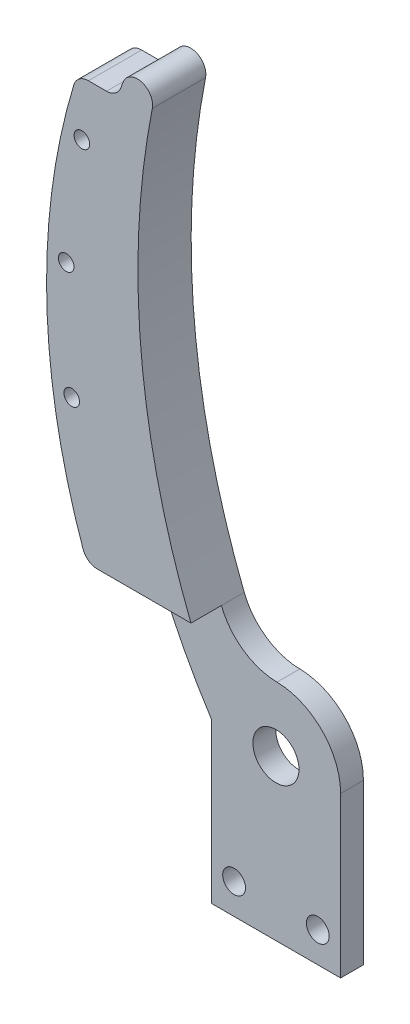
ISO-10303-21;
HEADER;
FILE_DESCRIPTION(('STEP AP214'),'2;1');
FILE_NAME('part.step','',(''),(''),'','','');
FILE_SCHEMA(('AUTOMOTIVE_DESIGN { 1 0 10303 214 1 1 1 1 }'));
ENDSEC;
DATA;
#1=APPLICATION_CONTEXT('core data for automotive mechanical design processes');
#2=APPLICATION_PROTOCOL_DEFINITION('international standard','automotive_design',2000,#1);
#3=PRODUCT_CONTEXT('',#1,'mechanical');
#4=PRODUCT('Part','Part','',(#3));
#5=PRODUCT_RELATED_PRODUCT_CATEGORY('part','',(#4));
#6=PRODUCT_DEFINITION_FORMATION('','',#4);
#7=PRODUCT_DEFINITION_CONTEXT('part definition',#1,'design');
#8=PRODUCT_DEFINITION('design','',#6,#7);
#9=PRODUCT_DEFINITION_SHAPE('','',#8);
#10=(LENGTH_UNIT() NAMED_UNIT(*) SI_UNIT(.MILLI.,.METRE.));
#11=(NAMED_UNIT(*) PLANE_ANGLE_UNIT() SI_UNIT($,.RADIAN.));
#12=(NAMED_UNIT(*) SI_UNIT($,.STERADIAN.) SOLID_ANGLE_UNIT());
#13=UNCERTAINTY_MEASURE_WITH_UNIT(LENGTH_MEASURE(1.E-05),#10,'distance_accuracy_value','');
#14=(GEOMETRIC_REPRESENTATION_CONTEXT(3) GLOBAL_UNCERTAINTY_ASSIGNED_CONTEXT((#13)) GLOBAL_UNIT_ASSIGNED_CONTEXT((#10,
#11,#12)) REPRESENTATION_CONTEXT('',''));
#15=CARTESIAN_POINT('',(0.,0.,0.));
#16=DIRECTION('',(0.,0.,1.));
#17=DIRECTION('',(1.,0.,0.));
#18=AXIS2_PLACEMENT_3D('',#15,#16,#17);
#19=CARTESIAN_POINT('',(0.,0.,7.));
#20=DIRECTION('',(0.,0.,1.));
#21=DIRECTION('',(1.,0.,0.));
#22=AXIS2_PLACEMENT_3D('',#19,#20,#21);
#23=PLANE('',#22);
#24=CARTESIAN_POINT('',(-13.0088572652672,82.4189639360738,7.));
#25=DIRECTION('',(0.,0.,-1.));
#26=DIRECTION('',(-1.,0.,0.));
#27=AXIS2_PLACEMENT_3D('',#24,#25,#26);
#28=CIRCLE('',#27,1.025);
#29=CARTESIAN_POINT('',(-14.0338572652672,82.4189639360738,7.));
#30=VERTEX_POINT('',#29);
#31=EDGE_CURVE('E365',#30,#30,#28,.T.);
#32=ORIENTED_EDGE('',*,*,#31,.T.);
#33=EDGE_LOOP('',(#32));
#34=FACE_BOUND('',#33,.T.);
#35=CARTESIAN_POINT('',(-15.0695569121837,67.4189639360738,7.));
#36=DIRECTION('',(0.,0.,-1.));
#37=DIRECTION('',(-1.,0.,0.));
#38=AXIS2_PLACEMENT_3D('',#35,#36,#37);
#39=CIRCLE('',#38,1.025);
#40=CARTESIAN_POINT('',(-16.0945569121837,67.4189639360738,7.));
#41=VERTEX_POINT('',#40);
#42=EDGE_CURVE('E356',#41,#41,#39,.T.);
#43=ORIENTED_EDGE('',*,*,#42,.T.);
#44=EDGE_LOOP('',(#43));
#45=FACE_BOUND('',#44,.T.);
#46=CARTESIAN_POINT('',(66.3533376194957,63.8746380364105,7.));
#47=DIRECTION('',(0.,0.,1.));
#48=DIRECTION('',(1.,0.,0.));
#49=AXIS2_PLACEMENT_3D('',#46,#47,#48);
#50=CIRCLE('',#49,84.);
#51=CARTESIAN_POINT('',(-12.850623404829,35.8972800829287,7.));
#52=VERTEX_POINT('',#51);
#53=CARTESIAN_POINT('',(-14.0651603690342,88.1411825219531,7.));
#54=VERTEX_POINT('',#53);
#55=EDGE_CURVE('E303',#52,#54,#50,.F.);
#56=ORIENTED_EDGE('',*,*,#55,.F.);
#57=CARTESIAN_POINT('',(-10.9648148090118,36.5634076532497,7.));
#58=DIRECTION('',(0.,0.,1.));
#59=DIRECTION('',(1.,0.,0.));
#60=AXIS2_PLACEMENT_3D('',#57,#58,#59);
#61=CIRCLE('',#60,2.);
#62=CARTESIAN_POINT('',(-10.9648148090118,34.5634076532497,7.));
#63=VERTEX_POINT('',#62);
#64=EDGE_CURVE('E167',#52,#63,#61,.T.);
#65=ORIENTED_EDGE('',*,*,#64,.T.);
#66=DIRECTION('',(1.,0.,0.));
#67=VECTOR('',#66,1.);
#68=CARTESIAN_POINT('',(0.,34.5634076532497,7.));
#69=LINE('',#68,#67);
#70=CARTESIAN_POINT('',(1.32762574070365,34.5634076532497,7.));
#71=VERTEX_POINT('',#70);
#72=EDGE_CURVE('E158',#63,#71,#69,.T.);
#73=ORIENTED_EDGE('',*,*,#72,.T.);
#74=CARTESIAN_POINT('',(94.3576937723887,71.243190122889,7.));
#75=DIRECTION('',(0.,0.,1.));
#76=DIRECTION('',(1.,0.,0.));
#77=AXIS2_PLACEMENT_3D('',#74,#75,#76);
#78=CIRCLE('',#77,100.);
#79=CARTESIAN_POINT('',(-3.74850130602634,90.6126115710371,7.));
#80=VERTEX_POINT('',#79);
#81=EDGE_CURVE('E164',#71,#80,#78,.F.);
#82=ORIENTED_EDGE('',*,*,#81,.T.);
#83=CARTESIAN_POINT('',(-5.71062520759463,91.,7.));
#84=DIRECTION('',(0.,0.,1.));
#85=DIRECTION('',(1.,0.,0.));
#86=AXIS2_PLACEMENT_3D('',#83,#84,#85);
#87=CIRCLE('',#86,1.99999999999999);
#88=CARTESIAN_POINT('',(-7.5824164498567,91.7045548561972,7.));
#89=VERTEX_POINT('',#88);
#90=EDGE_CURVE('E183',#80,#89,#87,.T.);
#91=ORIENTED_EDGE('',*,*,#90,.T.);
#92=CARTESIAN_POINT('',(66.3533376194957,63.8746380364105,7.));
#93=DIRECTION('',(0.,0.,1.));
#94=DIRECTION('',(1.,0.,0.));
#95=AXIS2_PLACEMENT_3D('',#92,#93,#94);
#96=CIRCLE('',#95,79.);
#97=CARTESIAN_POINT('',(-7.8876535794882,90.8797343293771,7.));
#98=VERTEX_POINT('',#97);
#99=EDGE_CURVE('E171',#89,#98,#96,.T.);
#100=ORIENTED_EDGE('',*,*,#99,.T.);
#101=CARTESIAN_POINT('',(-9.76717234401944,91.5634076532497,7.));
#102=DIRECTION('',(0.,0.,1.));
#103=DIRECTION('',(1.,0.,0.));
#104=AXIS2_PLACEMENT_3D('',#101,#102,#103);
#105=CIRCLE('',#104,2.);
#106=CARTESIAN_POINT('',(-9.76717234401944,89.5634076532497,7.));
#107=VERTEX_POINT('',#106);
#108=EDGE_CURVE('E11',#98,#107,#105,.F.);
#109=ORIENTED_EDGE('',*,*,#108,.T.);
#110=DIRECTION('',(1.,0.,0.));
#111=VECTOR('',#110,1.);
#112=CARTESIAN_POINT('',(-8.35333621606578,89.5634076532497,7.));
#113=LINE('',#112,#111);
#114=CARTESIAN_POINT('',(-12.1504342264502,89.5634076532497,7.));
#115=VERTEX_POINT('',#114);
#116=EDGE_CURVE('E192',#115,#107,#113,.T.);
#117=ORIENTED_EDGE('',*,*,#116,.F.);
#118=CARTESIAN_POINT('',(-12.1504342264502,87.5634076532497,7.));
#119=DIRECTION('',(0.,0.,1.));
#120=DIRECTION('',(1.,0.,0.));
#121=AXIS2_PLACEMENT_3D('',#118,#119,#120);
#122=CIRCLE('',#121,2.);
#123=EDGE_CURVE('E275',#115,#54,#122,.T.);
#124=ORIENTED_EDGE('',*,*,#123,.T.);
#125=EDGE_LOOP('',(#56,#65,#73,#82,#91,#100,#109,#117,#124));
#126=FACE_BOUND('',#125,.T.);
#127=CARTESIAN_POINT('',(-14.337538760098,52.4189639360738,7.));
#128=DIRECTION('',(0.,0.,-1.));
#129=DIRECTION('',(-1.,0.,0.));
#130=AXIS2_PLACEMENT_3D('',#127,#128,#129);
#131=CIRCLE('',#130,1.025);
#132=CARTESIAN_POINT('',(-15.362538760098,52.4189639360738,7.));
#133=VERTEX_POINT('',#132);
#134=EDGE_CURVE('E349',#133,#133,#131,.T.);
#135=ORIENTED_EDGE('',*,*,#134,.T.);
#136=EDGE_LOOP('',(#135));
#137=FACE_BOUND('',#136,.T.);
#138=ADVANCED_FACE('F43',(#34,#45,#126,#137),#23,.T.);
#139=CARTESIAN_POINT('',(66.3533376194957,63.8746380364105,3.));
#140=DIRECTION('',(0.,0.,-1.));
#141=DIRECTION('',(-1.,0.,0.));
#142=AXIS2_PLACEMENT_3D('',#139,#140,#141);
#143=CYLINDRICAL_SURFACE('',#142,79.);
#144=CARTESIAN_POINT('',(66.3533376194957,63.8746380364105,3.));
#145=DIRECTION('',(0.,0.,1.));
#146=DIRECTION('',(1.,0.,0.));
#147=AXIS2_PLACEMENT_3D('',#144,#145,#146);
#148=CIRCLE('',#147,79.);
#149=CARTESIAN_POINT('',(-6.50559195510468,33.3365244528339,3.));
#150=VERTEX_POINT('',#149);
#151=CARTESIAN_POINT('',(0.,21.,3.));
#152=VERTEX_POINT('',#151);
#153=EDGE_CURVE('E219',#150,#152,#148,.T.);
#154=ORIENTED_EDGE('',*,*,#153,.F.);
#155=DIRECTION('',(0.,0.,-1.));
#156=VECTOR('',#155,1.);
#157=CARTESIAN_POINT('',(-6.50559195510468,33.3365244528339,3.));
#158=LINE('',#157,#156);
#159=CARTESIAN_POINT('',(-6.50559195510468,33.3365244528339,0.));
#160=VERTEX_POINT('',#159);
#161=EDGE_CURVE('E259',#150,#160,#158,.T.);
#162=ORIENTED_EDGE('',*,*,#161,.T.);
#163=CARTESIAN_POINT('',(66.3533376194957,63.8746380364105,0.));
#164=DIRECTION('',(0.,0.,1.));
#165=DIRECTION('',(1.,0.,0.));
#166=AXIS2_PLACEMENT_3D('',#163,#164,#165);
#167=CIRCLE('',#166,79.);
#168=CARTESIAN_POINT('',(0.,21.,0.));
#169=VERTEX_POINT('',#168);
#170=EDGE_CURVE('E236',#160,#169,#167,.T.);
#171=ORIENTED_EDGE('',*,*,#170,.T.);
#172=DIRECTION('',(0.,0.,-1.));
#173=VECTOR('',#172,1.);
#174=CARTESIAN_POINT('',(0.,21.,3.));
#175=LINE('',#174,#173);
#176=EDGE_CURVE('E221',#152,#169,#175,.T.);
#177=ORIENTED_EDGE('',*,*,#176,.F.);
#178=EDGE_LOOP('',(#154,#162,#171,#177));
#179=FACE_BOUND('',#178,.T.);
#180=ADVANCED_FACE('F342',(#179),#143,.T.);
#181=CARTESIAN_POINT('',(8.5,21.,3.));
#182=DIRECTION('',(0.,0.,1.));
#183=DIRECTION('',(1.,0.,0.));
#184=AXIS2_PLACEMENT_3D('',#181,#182,#183);
#185=PLANE('',#184);
#186=DIRECTION('',(1.,0.,0.));
#187=VECTOR('',#186,1.);
#188=CARTESIAN_POINT('',(0.,34.5634076532497,3.));
#189=LINE('',#188,#187);
#190=CARTESIAN_POINT('',(-8.3501218177528,34.5634076532497,3.));
#191=VERTEX_POINT('',#190);
#192=CARTESIAN_POINT('',(1.32762574070365,34.5634076532497,3.));
#193=VERTEX_POINT('',#192);
#194=EDGE_CURVE('E179',#191,#193,#189,.T.);
#195=ORIENTED_EDGE('',*,*,#194,.F.);
#196=CARTESIAN_POINT('',(-8.3501218177528,32.5634076532497,3.));
#197=DIRECTION('',(0.,0.,1.));
#198=DIRECTION('',(1.,0.,0.));
#199=AXIS2_PLACEMENT_3D('',#196,#197,#198);
#200=CIRCLE('',#199,2.);
#201=EDGE_CURVE('E286',#191,#150,#200,.F.);
#202=ORIENTED_EDGE('',*,*,#201,.T.);
#203=ORIENTED_EDGE('',*,*,#153,.T.);
#204=DIRECTION('',(0.,-1.,0.));
#205=VECTOR('',#204,1.);
#206=CARTESIAN_POINT('',(0.,21.,3.));
#207=LINE('',#206,#205);
#208=CARTESIAN_POINT('',(0.,0.,3.));
#209=VERTEX_POINT('',#208);
#210=EDGE_CURVE('E206',#152,#209,#207,.T.);
#211=ORIENTED_EDGE('',*,*,#210,.T.);
#212=DIRECTION('',(1.,0.,0.));
#213=VECTOR('',#212,1.);
#214=CARTESIAN_POINT('',(0.,0.,3.));
#215=LINE('',#214,#213);
#216=CARTESIAN_POINT('',(17.,0.,3.));
#217=VERTEX_POINT('',#216);
#218=EDGE_CURVE('E209',#209,#217,#215,.T.);
#219=ORIENTED_EDGE('',*,*,#218,.T.);
#220=DIRECTION('',(0.,1.,0.));
#221=VECTOR('',#220,1.);
#222=CARTESIAN_POINT('',(17.,0.,3.));
#223=LINE('',#222,#221);
#224=CARTESIAN_POINT('',(17.,21.,3.));
#225=VERTEX_POINT('',#224);
#226=EDGE_CURVE('E212',#217,#225,#223,.T.);
#227=ORIENTED_EDGE('',*,*,#226,.T.);
#228=CARTESIAN_POINT('',(8.5,21.,3.));
#229=DIRECTION('',(0.,0.,1.));
#230=DIRECTION('',(1.,0.,0.));
#231=AXIS2_PLACEMENT_3D('',#228,#229,#230);
#232=CIRCLE('',#231,8.5);
#233=CARTESIAN_POINT('',(8.63910697318345,29.4988616443623,3.));
#234=VERTEX_POINT('',#233);
#235=EDGE_CURVE('E214',#225,#234,#232,.T.);
#236=ORIENTED_EDGE('',*,*,#235,.T.);
#237=CARTESIAN_POINT('',(8.77003118323847,37.4977902508208,3.));
#238=DIRECTION('',(0.,0.,-1.));
#239=DIRECTION('',(-1.,0.,0.));
#240=AXIS2_PLACEMENT_3D('',#237,#238,#239);
#241=CIRCLE('',#240,8.00000000000001);
#242=EDGE_CURVE('E216',#234,#193,#241,.T.);
#243=ORIENTED_EDGE('',*,*,#242,.T.);
#244=EDGE_LOOP('',(#195,#202,#203,#211,#219,#227,#236,#243));
#245=FACE_BOUND('',#244,.T.);
#246=CARTESIAN_POINT('',(14.,4.,3.));
#247=DIRECTION('',(0.,0.,1.));
#248=DIRECTION('',(1.,0.,0.));
#249=AXIS2_PLACEMENT_3D('',#246,#247,#248);
#250=CIRCLE('',#249,1.5);
#251=CARTESIAN_POINT('',(15.5,4.,3.));
#252=VERTEX_POINT('',#251);
#253=EDGE_CURVE('E202',#252,#252,#250,.T.);
#254=ORIENTED_EDGE('',*,*,#253,.F.);
#255=EDGE_LOOP('',(#254));
#256=FACE_BOUND('',#255,.T.);
#257=CARTESIAN_POINT('',(3.,4.,3.));
#258=DIRECTION('',(0.,0.,1.));
#259=DIRECTION('',(1.,0.,0.));
#260=AXIS2_PLACEMENT_3D('',#257,#258,#259);
#261=CIRCLE('',#260,1.5);
#262=CARTESIAN_POINT('',(4.5,4.,3.));
#263=VERTEX_POINT('',#262);
#264=EDGE_CURVE('E197',#263,#263,#261,.T.);
#265=ORIENTED_EDGE('',*,*,#264,.F.);
#266=EDGE_LOOP('',(#265));
#267=FACE_BOUND('',#266,.T.);
#268=CARTESIAN_POINT('',(8.5,21.,3.));
#269=DIRECTION('',(0.,0.,1.));
#270=DIRECTION('',(1.,0.,0.));
#271=AXIS2_PLACEMENT_3D('',#268,#269,#270);
#272=CIRCLE('',#271,3.03);
#273=CARTESIAN_POINT('',(11.53,21.,3.));
#274=VERTEX_POINT('',#273);
#275=EDGE_CURVE('E371',#274,#274,#272,.F.);
#276=ORIENTED_EDGE('',*,*,#275,.T.);
#277=EDGE_LOOP('',(#276));
#278=FACE_BOUND('',#277,.T.);
#279=ADVANCED_FACE('F319',(#245,#256,#267,#278),#185,.T.);
#280=CARTESIAN_POINT('',(8.5,21.,0.));
#281=DIRECTION('',(0.,0.,1.));
#282=DIRECTION('',(1.,0.,0.));
#283=AXIS2_PLACEMENT_3D('',#280,#281,#282);
#284=PLANE('',#283);
#285=CARTESIAN_POINT('',(-13.0088572652672,82.4189639360738,0.));
#286=DIRECTION('',(0.,0.,-1.));
#287=DIRECTION('',(-1.,0.,0.));
#288=AXIS2_PLACEMENT_3D('',#285,#286,#287);
#289=CIRCLE('',#288,1.02499999999999);
#290=CARTESIAN_POINT('',(-14.0338572652672,82.4189639360738,0.));
#291=VERTEX_POINT('',#290);
#292=EDGE_CURVE('E368',#291,#291,#289,.T.);
#293=ORIENTED_EDGE('',*,*,#292,.F.);
#294=EDGE_LOOP('',(#293));
#295=FACE_BOUND('',#294,.T.);
#296=CARTESIAN_POINT('',(-15.0695569121837,67.4189639360738,0.));
#297=DIRECTION('',(0.,0.,-1.));
#298=DIRECTION('',(-1.,0.,0.));
#299=AXIS2_PLACEMENT_3D('',#296,#297,#298);
#300=CIRCLE('',#299,1.02499999999999);
#301=CARTESIAN_POINT('',(-16.0945569121836,67.4189639360738,0.));
#302=VERTEX_POINT('',#301);
#303=EDGE_CURVE('E362',#302,#302,#300,.T.);
#304=ORIENTED_EDGE('',*,*,#303,.F.);
#305=EDGE_LOOP('',(#304));
#306=FACE_BOUND('',#305,.T.);
#307=CARTESIAN_POINT('',(-14.337538760098,52.4189639360738,0.));
#308=DIRECTION('',(0.,0.,-1.));
#309=DIRECTION('',(-1.,0.,0.));
#310=AXIS2_PLACEMENT_3D('',#307,#308,#309);
#311=CIRCLE('',#310,1.02499999999999);
#312=CARTESIAN_POINT('',(-15.362538760098,52.4189639360738,0.));
#313=VERTEX_POINT('',#312);
#314=EDGE_CURVE('E352',#313,#313,#311,.T.);
#315=ORIENTED_EDGE('',*,*,#314,.F.);
#316=EDGE_LOOP('',(#315));
#317=FACE_BOUND('',#316,.T.);
#318=CARTESIAN_POINT('',(14.,4.,0.));
#319=DIRECTION('',(0.,0.,-1.));
#320=DIRECTION('',(-1.,0.,0.));
#321=AXIS2_PLACEMENT_3D('',#318,#319,#320);
#322=CIRCLE('',#321,1.5);
#323=CARTESIAN_POINT('',(12.5,4.,0.));
#324=VERTEX_POINT('',#323);
#325=EDGE_CURVE('E194',#324,#324,#322,.T.);
#326=ORIENTED_EDGE('',*,*,#325,.F.);
#327=EDGE_LOOP('',(#326));
#328=FACE_BOUND('',#327,.T.);
#329=CARTESIAN_POINT('',(3.,4.,0.));
#330=DIRECTION('',(0.,0.,-1.));
#331=DIRECTION('',(1.,0.,0.));
#332=AXIS2_PLACEMENT_3D('',#329,#330,#331);
#333=CIRCLE('',#332,1.5);
#334=CARTESIAN_POINT('',(4.5,4.,0.));
#335=VERTEX_POINT('',#334);
#336=EDGE_CURVE('E182',#335,#335,#333,.T.);
#337=ORIENTED_EDGE('',*,*,#336,.F.);
#338=EDGE_LOOP('',(#337));
#339=FACE_BOUND('',#338,.T.);
#340=DIRECTION('',(-1.,0.,0.));
#341=VECTOR('',#340,1.);
#342=CARTESIAN_POINT('',(-12.3667473234544,34.5634076532497,0.));
#343=LINE('',#342,#341);
#344=CARTESIAN_POINT('',(-8.3501218177528,34.5634076532497,0.));
#345=VERTEX_POINT('',#344);
#346=CARTESIAN_POINT('',(-10.9648148090118,34.5634076532497,0.));
#347=VERTEX_POINT('',#346);
#348=EDGE_CURVE('E308',#345,#347,#343,.T.);
#349=ORIENTED_EDGE('',*,*,#348,.T.);
#350=CARTESIAN_POINT('',(-10.9648148090118,36.5634076532497,0.));
#351=DIRECTION('',(0.,0.,1.));
#352=DIRECTION('',(1.,0.,0.));
#353=AXIS2_PLACEMENT_3D('',#350,#351,#352);
#354=CIRCLE('',#353,2.);
#355=CARTESIAN_POINT('',(-12.850623404829,35.8972800829287,0.));
#356=VERTEX_POINT('',#355);
#357=EDGE_CURVE('E268',#347,#356,#354,.F.);
#358=ORIENTED_EDGE('',*,*,#357,.T.);
#359=CARTESIAN_POINT('',(66.3533376194957,63.8746380364105,0.));
#360=DIRECTION('',(0.,0.,-1.));
#361=DIRECTION('',(-1.,0.,0.));
#362=AXIS2_PLACEMENT_3D('',#359,#360,#361);
#363=CIRCLE('',#362,84.);
#364=CARTESIAN_POINT('',(-14.0651603690342,88.1411825219531,0.));
#365=VERTEX_POINT('',#364);
#366=EDGE_CURVE('E348',#356,#365,#363,.T.);
#367=ORIENTED_EDGE('',*,*,#366,.T.);
#368=CARTESIAN_POINT('',(-12.1504342264502,87.5634076532497,0.));
#369=DIRECTION('',(0.,0.,1.));
#370=DIRECTION('',(1.,0.,0.));
#371=AXIS2_PLACEMENT_3D('',#368,#369,#370);
#372=CIRCLE('',#371,2.);
#373=CARTESIAN_POINT('',(-12.1504342264502,89.5634076532497,0.));
#374=VERTEX_POINT('',#373);
#375=EDGE_CURVE('E266',#365,#374,#372,.F.);
#376=ORIENTED_EDGE('',*,*,#375,.T.);
#377=DIRECTION('',(1.,0.,0.));
#378=VECTOR('',#377,1.);
#379=CARTESIAN_POINT('',(-8.35333621606578,89.5634076532497,0.));
#380=LINE('',#379,#378);
#381=CARTESIAN_POINT('',(-9.76717234401944,89.5634076532497,0.));
#382=VERTEX_POINT('',#381);
#383=EDGE_CURVE('E294',#374,#382,#380,.T.);
#384=ORIENTED_EDGE('',*,*,#383,.T.);
#385=CARTESIAN_POINT('',(-9.76717234401944,91.5634076532497,0.));
#386=DIRECTION('',(0.,0.,1.));
#387=DIRECTION('',(1.,0.,0.));
#388=AXIS2_PLACEMENT_3D('',#385,#386,#387);
#389=CIRCLE('',#388,2.);
#390=CARTESIAN_POINT('',(-7.8876535794882,90.8797343293771,0.));
#391=VERTEX_POINT('',#390);
#392=EDGE_CURVE('E51',#382,#391,#389,.T.);
#393=ORIENTED_EDGE('',*,*,#392,.T.);
#394=CARTESIAN_POINT('',(-7.58241644985671,91.7045548561971,0.));
#395=VERTEX_POINT('',#394);
#396=EDGE_CURVE('E210',#395,#391,#167,.T.);
#397=ORIENTED_EDGE('',*,*,#396,.F.);
#398=CARTESIAN_POINT('',(-5.71062520759463,91.,0.));
#399=DIRECTION('',(0.,0.,1.));
#400=DIRECTION('',(1.,0.,0.));
#401=AXIS2_PLACEMENT_3D('',#398,#399,#400);
#402=CIRCLE('',#401,1.99999999999999);
#403=CARTESIAN_POINT('',(-3.74850130602634,90.6126115710371,0.));
#404=VERTEX_POINT('',#403);
#405=EDGE_CURVE('E234',#404,#395,#402,.T.);
#406=ORIENTED_EDGE('',*,*,#405,.F.);
#407=CARTESIAN_POINT('',(94.3576937723887,71.243190122889,0.));
#408=DIRECTION('',(0.,0.,-1.));
#409=DIRECTION('',(-1.,0.,0.));
#410=AXIS2_PLACEMENT_3D('',#407,#408,#409);
#411=CIRCLE('',#410,100.);
#412=CARTESIAN_POINT('',(1.32762574070365,34.5634076532497,0.));
#413=VERTEX_POINT('',#412);
#414=EDGE_CURVE('E232',#413,#404,#411,.T.);
#415=ORIENTED_EDGE('',*,*,#414,.F.);
#416=CARTESIAN_POINT('',(8.77003118323847,37.4977902508208,0.));
#417=DIRECTION('',(0.,0.,-1.));
#418=DIRECTION('',(-1.,0.,0.));
#419=AXIS2_PLACEMENT_3D('',#416,#417,#418);
#420=CIRCLE('',#419,8.00000000000001);
#421=CARTESIAN_POINT('',(8.63910697318345,29.4988616443623,0.));
#422=VERTEX_POINT('',#421);
#423=EDGE_CURVE('E230',#422,#413,#420,.T.);
#424=ORIENTED_EDGE('',*,*,#423,.F.);
#425=CARTESIAN_POINT('',(8.5,21.,0.));
#426=DIRECTION('',(0.,0.,1.));
#427=DIRECTION('',(1.,0.,0.));
#428=AXIS2_PLACEMENT_3D('',#425,#426,#427);
#429=CIRCLE('',#428,8.5);
#430=CARTESIAN_POINT('',(17.,21.,0.));
#431=VERTEX_POINT('',#430);
#432=EDGE_CURVE('E228',#431,#422,#429,.T.);
#433=ORIENTED_EDGE('',*,*,#432,.F.);
#434=DIRECTION('',(0.,1.,0.));
#435=VECTOR('',#434,1.);
#436=CARTESIAN_POINT('',(17.,0.,0.));
#437=LINE('',#436,#435);
#438=CARTESIAN_POINT('',(17.,0.,0.));
#439=VERTEX_POINT('',#438);
#440=EDGE_CURVE('E226',#439,#431,#437,.T.);
#441=ORIENTED_EDGE('',*,*,#440,.F.);
#442=DIRECTION('',(1.,0.,0.));
#443=VECTOR('',#442,1.);
#444=CARTESIAN_POINT('',(0.,0.,0.));
#445=LINE('',#444,#443);
#446=CARTESIAN_POINT('',(0.,0.,0.));
#447=VERTEX_POINT('',#446);
#448=EDGE_CURVE('E224',#447,#439,#445,.T.);
#449=ORIENTED_EDGE('',*,*,#448,.F.);
#450=DIRECTION('',(0.,-1.,0.));
#451=VECTOR('',#450,1.);
#452=CARTESIAN_POINT('',(0.,21.,0.));
#453=LINE('',#452,#451);
#454=EDGE_CURVE('E205',#169,#447,#453,.T.);
#455=ORIENTED_EDGE('',*,*,#454,.F.);
#456=ORIENTED_EDGE('',*,*,#170,.F.);
#457=CARTESIAN_POINT('',(-8.3501218177528,32.5634076532497,0.));
#458=DIRECTION('',(0.,0.,1.));
#459=DIRECTION('',(1.,0.,0.));
#460=AXIS2_PLACEMENT_3D('',#457,#458,#459);
#461=CIRCLE('',#460,2.);
#462=EDGE_CURVE('E284',#160,#345,#461,.T.);
#463=ORIENTED_EDGE('',*,*,#462,.T.);
#464=EDGE_LOOP('',(#349,#358,#367,#376,#384,#393,#397,#406,#415,#424,#433,#441,#449,#455,#456,#463));
#465=FACE_BOUND('',#464,.T.);
#466=CARTESIAN_POINT('',(8.5,21.,0.));
#467=DIRECTION('',(0.,0.,-1.));
#468=DIRECTION('',(-1.,0.,0.));
#469=AXIS2_PLACEMENT_3D('',#466,#467,#468);
#470=CIRCLE('',#469,3.03);
#471=CARTESIAN_POINT('',(5.47,21.,0.));
#472=VERTEX_POINT('',#471);
#473=EDGE_CURVE('E374',#472,#472,#470,.T.);
#474=ORIENTED_EDGE('',*,*,#473,.F.);
#475=EDGE_LOOP('',(#474));
#476=FACE_BOUND('',#475,.T.);
#477=ADVANCED_FACE('F291',(#295,#306,#317,#328,#339,#465,#476),#284,.F.);
#478=CARTESIAN_POINT('',(0.,21.,3.));
#479=DIRECTION('',(1.,0.,0.));
#480=DIRECTION('',(0.,1.,0.));
#481=AXIS2_PLACEMENT_3D('',#478,#479,#480);
#482=PLANE('',#481);
#483=ORIENTED_EDGE('',*,*,#454,.T.);
#484=DIRECTION('',(0.,0.,-1.));
#485=VECTOR('',#484,1.);
#486=CARTESIAN_POINT('',(0.,0.,3.));
#487=LINE('',#486,#485);
#488=EDGE_CURVE('E256',#209,#447,#487,.T.);
#489=ORIENTED_EDGE('',*,*,#488,.F.);
#490=ORIENTED_EDGE('',*,*,#210,.F.);
#491=ORIENTED_EDGE('',*,*,#176,.T.);
#492=EDGE_LOOP('',(#483,#489,#490,#491));
#493=FACE_BOUND('',#492,.T.);
#494=ADVANCED_FACE('F337',(#493),#482,.F.);
#495=CARTESIAN_POINT('',(0.,0.,3.));
#496=DIRECTION('',(0.,1.,0.));
#497=DIRECTION('',(-1.,0.,0.));
#498=AXIS2_PLACEMENT_3D('',#495,#496,#497);
#499=PLANE('',#498);
#500=ORIENTED_EDGE('',*,*,#448,.T.);
#501=DIRECTION('',(0.,0.,-1.));
#502=VECTOR('',#501,1.);
#503=CARTESIAN_POINT('',(17.,0.,3.));
#504=LINE('',#503,#502);
#505=EDGE_CURVE('E253',#217,#439,#504,.T.);
#506=ORIENTED_EDGE('',*,*,#505,.F.);
#507=ORIENTED_EDGE('',*,*,#218,.F.);
#508=ORIENTED_EDGE('',*,*,#488,.T.);
#509=EDGE_LOOP('',(#500,#506,#507,#508));
#510=FACE_BOUND('',#509,.T.);
#511=ADVANCED_FACE('F333',(#510),#499,.F.);
#512=CARTESIAN_POINT('',(17.,0.,3.));
#513=DIRECTION('',(-1.,0.,0.));
#514=DIRECTION('',(0.,0.,1.));
#515=AXIS2_PLACEMENT_3D('',#512,#513,#514);
#516=PLANE('',#515);
#517=ORIENTED_EDGE('',*,*,#440,.T.);
#518=DIRECTION('',(0.,0.,-1.));
#519=VECTOR('',#518,1.);
#520=CARTESIAN_POINT('',(17.,21.,3.));
#521=LINE('',#520,#519);
#522=EDGE_CURVE('E250',#225,#431,#521,.T.);
#523=ORIENTED_EDGE('',*,*,#522,.F.);
#524=ORIENTED_EDGE('',*,*,#226,.F.);
#525=ORIENTED_EDGE('',*,*,#505,.T.);
#526=EDGE_LOOP('',(#517,#523,#524,#525));
#527=FACE_BOUND('',#526,.T.);
#528=ADVANCED_FACE('F330',(#527),#516,.F.);
#529=CARTESIAN_POINT('',(8.5,21.,3.));
#530=DIRECTION('',(0.,0.,-1.));
#531=DIRECTION('',(-1.,0.,0.));
#532=AXIS2_PLACEMENT_3D('',#529,#530,#531);
#533=CYLINDRICAL_SURFACE('',#532,8.5);
#534=ORIENTED_EDGE('',*,*,#432,.T.);
#535=DIRECTION('',(0.,0.,-1.));
#536=VECTOR('',#535,1.);
#537=CARTESIAN_POINT('',(8.63910697318345,29.4988616443623,3.));
#538=LINE('',#537,#536);
#539=EDGE_CURVE('E247',#234,#422,#538,.T.);
#540=ORIENTED_EDGE('',*,*,#539,.F.);
#541=ORIENTED_EDGE('',*,*,#235,.F.);
#542=ORIENTED_EDGE('',*,*,#522,.T.);
#543=EDGE_LOOP('',(#534,#540,#541,#542));
#544=FACE_BOUND('',#543,.T.);
#545=ADVANCED_FACE('F326',(#544),#533,.T.);
#546=CARTESIAN_POINT('',(8.77003118323847,37.4977902508208,3.));
#547=DIRECTION('',(0.,0.,-1.));
#548=DIRECTION('',(-1.,0.,0.));
#549=AXIS2_PLACEMENT_3D('',#546,#547,#548);
#550=CYLINDRICAL_SURFACE('',#549,8.00000000000001);
#551=ORIENTED_EDGE('',*,*,#423,.T.);
#552=DIRECTION('',(0.,0.,-1.));
#553=VECTOR('',#552,1.);
#554=CARTESIAN_POINT('',(1.32762574070365,34.5634076532497,3.));
#555=LINE('',#554,#553);
#556=EDGE_CURVE('E245',#193,#413,#555,.T.);
#557=ORIENTED_EDGE('',*,*,#556,.F.);
#558=ORIENTED_EDGE('',*,*,#242,.F.);
#559=ORIENTED_EDGE('',*,*,#539,.T.);
#560=EDGE_LOOP('',(#551,#557,#558,#559));
#561=FACE_BOUND('',#560,.T.);
#562=ADVANCED_FACE('F317',(#561),#550,.F.);
#563=CARTESIAN_POINT('',(94.3576937723887,71.243190122889,3.));
#564=DIRECTION('',(0.,0.,-1.));
#565=DIRECTION('',(-1.,0.,0.));
#566=AXIS2_PLACEMENT_3D('',#563,#564,#565);
#567=CYLINDRICAL_SURFACE('',#566,100.);
#568=ORIENTED_EDGE('',*,*,#414,.T.);
#569=DIRECTION('',(0.,0.,-1.));
#570=VECTOR('',#569,1.);
#571=CARTESIAN_POINT('',(-3.74850130602634,90.6126115710371,3.));
#572=LINE('',#571,#570);
#573=EDGE_CURVE('E187',#80,#404,#572,.T.);
#574=ORIENTED_EDGE('',*,*,#573,.F.);
#575=ORIENTED_EDGE('',*,*,#81,.F.);
#576=DIRECTION('',(0.,0.,-1.));
#577=VECTOR('',#576,1.);
#578=CARTESIAN_POINT('',(1.32762574070365,34.5634076532497,7.));
#579=LINE('',#578,#577);
#580=EDGE_CURVE('E175',#71,#193,#579,.T.);
#581=ORIENTED_EDGE('',*,*,#580,.T.);
#582=ORIENTED_EDGE('',*,*,#556,.T.);
#583=EDGE_LOOP('',(#568,#574,#575,#581,#582));
#584=FACE_BOUND('',#583,.T.);
#585=ADVANCED_FACE('F185',(#584),#567,.F.);
#586=CARTESIAN_POINT('',(-5.71062520759463,91.,3.));
#587=DIRECTION('',(0.,0.,-1.));
#588=DIRECTION('',(-1.,0.,0.));
#589=AXIS2_PLACEMENT_3D('',#586,#587,#588);
#590=CYLINDRICAL_SURFACE('',#589,1.99999999999999);
#591=ORIENTED_EDGE('',*,*,#405,.T.);
#592=DIRECTION('',(0.,0.,-1.));
#593=VECTOR('',#592,1.);
#594=CARTESIAN_POINT('',(-7.58241644985671,91.7045548561971,3.));
#595=LINE('',#594,#593);
#596=EDGE_CURVE('E241',#89,#395,#595,.T.);
#597=ORIENTED_EDGE('',*,*,#596,.F.);
#598=ORIENTED_EDGE('',*,*,#90,.F.);
#599=ORIENTED_EDGE('',*,*,#573,.T.);
#600=EDGE_LOOP('',(#591,#597,#598,#599));
#601=FACE_BOUND('',#600,.T.);
#602=ADVANCED_FACE('F311',(#601),#590,.T.);
#603=ORIENTED_EDGE('',*,*,#396,.T.);
#604=DIRECTION('',(0.,0.,-1.));
#605=VECTOR('',#604,1.);
#606=CARTESIAN_POINT('',(-7.88765357948822,90.8797343293771,3.));
#607=LINE('',#606,#605);
#608=EDGE_CURVE('E282',#391,#98,#607,.F.);
#609=ORIENTED_EDGE('',*,*,#608,.T.);
#610=ORIENTED_EDGE('',*,*,#99,.F.);
#611=ORIENTED_EDGE('',*,*,#596,.T.);
#612=EDGE_LOOP('',(#603,#609,#610,#611));
#613=FACE_BOUND('',#612,.T.);
#614=ADVANCED_FACE('F299',(#613),#143,.T.);
#615=CARTESIAN_POINT('',(3.,4.,10.));
#616=DIRECTION('',(0.,0.,-1.));
#617=DIRECTION('',(-1.,0.,0.));
#618=AXIS2_PLACEMENT_3D('',#615,#616,#617);
#619=CYLINDRICAL_SURFACE('',#618,1.5);
#620=ORIENTED_EDGE('',*,*,#264,.T.);
#621=EDGE_LOOP('',(#620));
#622=FACE_BOUND('',#621,.T.);
#623=ORIENTED_EDGE('',*,*,#336,.T.);
#624=EDGE_LOOP('',(#623));
#625=FACE_BOUND('',#624,.T.);
#626=ADVANCED_FACE('F411',(#622,#625),#619,.F.);
#627=CARTESIAN_POINT('',(14.,4.,10.));
#628=DIRECTION('',(0.,0.,-1.));
#629=DIRECTION('',(-1.,0.,0.));
#630=AXIS2_PLACEMENT_3D('',#627,#628,#629);
#631=CYLINDRICAL_SURFACE('',#630,1.5);
#632=ORIENTED_EDGE('',*,*,#253,.T.);
#633=EDGE_LOOP('',(#632));
#634=FACE_BOUND('',#633,.T.);
#635=ORIENTED_EDGE('',*,*,#325,.T.);
#636=EDGE_LOOP('',(#635));
#637=FACE_BOUND('',#636,.T.);
#638=ADVANCED_FACE('F408',(#634,#637),#631,.F.);
#639=CARTESIAN_POINT('',(0.,34.5634076532497,7.));
#640=DIRECTION('',(0.,1.,0.));
#641=DIRECTION('',(-1.,0.,0.));
#642=AXIS2_PLACEMENT_3D('',#639,#640,#641);
#643=PLANE('',#642);
#644=ORIENTED_EDGE('',*,*,#348,.F.);
#645=DIRECTION('',(0.,0.,1.));
#646=VECTOR('',#645,1.);
#647=CARTESIAN_POINT('',(-8.3501218177528,34.5634076532497,3.));
#648=LINE('',#647,#646);
#649=EDGE_CURVE('E264',#345,#191,#648,.T.);
#650=ORIENTED_EDGE('',*,*,#649,.T.);
#651=ORIENTED_EDGE('',*,*,#194,.T.);
#652=ORIENTED_EDGE('',*,*,#580,.F.);
#653=ORIENTED_EDGE('',*,*,#72,.F.);
#654=DIRECTION('',(0.,0.,1.));
#655=VECTOR('',#654,1.);
#656=CARTESIAN_POINT('',(-10.9648148090118,34.5634076532497,0.));
#657=LINE('',#656,#655);
#658=EDGE_CURVE('E262',#63,#347,#657,.F.);
#659=ORIENTED_EDGE('',*,*,#658,.T.);
#660=EDGE_LOOP('',(#644,#650,#651,#652,#653,#659));
#661=FACE_BOUND('',#660,.T.);
#662=ADVANCED_FACE('F177',(#661),#643,.F.);
#663=CARTESIAN_POINT('',(66.3533376194957,63.8746380364105,63.0195151716117));
#664=DIRECTION('',(0.,0.,-1.));
#665=DIRECTION('',(-1.,0.,0.));
#666=AXIS2_PLACEMENT_3D('',#663,#664,#665);
#667=CYLINDRICAL_SURFACE('',#666,84.);
#668=ORIENTED_EDGE('',*,*,#366,.F.);
#669=DIRECTION('',(0.,0.,-1.));
#670=VECTOR('',#669,1.);
#671=CARTESIAN_POINT('',(-12.850623404829,35.8972800829287,63.0195151716117));
#672=LINE('',#671,#670);
#673=EDGE_CURVE('E273',#356,#52,#672,.F.);
#674=ORIENTED_EDGE('',*,*,#673,.T.);
#675=ORIENTED_EDGE('',*,*,#55,.T.);
#676=DIRECTION('',(0.,0.,-1.));
#677=VECTOR('',#676,1.);
#678=CARTESIAN_POINT('',(-14.0651603690342,88.1411825219531,63.0195151716117));
#679=LINE('',#678,#677);
#680=EDGE_CURVE('E270',#54,#365,#679,.T.);
#681=ORIENTED_EDGE('',*,*,#680,.T.);
#682=EDGE_LOOP('',(#668,#674,#675,#681));
#683=FACE_BOUND('',#682,.T.);
#684=ADVANCED_FACE('F404',(#683),#667,.T.);
#685=CARTESIAN_POINT('',(-8.35333621606578,89.5634076532497,63.0195151716117));
#686=DIRECTION('',(0.,1.,0.));
#687=DIRECTION('',(0.,0.,1.));
#688=AXIS2_PLACEMENT_3D('',#685,#686,#687);
#689=PLANE('',#688);
#690=ORIENTED_EDGE('',*,*,#383,.F.);
#691=DIRECTION('',(0.,0.,-1.));
#692=VECTOR('',#691,1.);
#693=CARTESIAN_POINT('',(-12.1504342264502,89.5634076532497,63.0195151716117));
#694=LINE('',#693,#692);
#695=EDGE_CURVE('E63',#374,#115,#694,.F.);
#696=ORIENTED_EDGE('',*,*,#695,.T.);
#697=ORIENTED_EDGE('',*,*,#116,.T.);
#698=DIRECTION('',(0.,0.,-1.));
#699=VECTOR('',#698,1.);
#700=CARTESIAN_POINT('',(-9.76717234401944,89.5634076532497,63.0195151716117));
#701=LINE('',#700,#699);
#702=EDGE_CURVE('E278',#107,#382,#701,.T.);
#703=ORIENTED_EDGE('',*,*,#702,.T.);
#704=EDGE_LOOP('',(#690,#696,#697,#703));
#705=FACE_BOUND('',#704,.T.);
#706=ADVANCED_FACE('F301',(#705),#689,.T.);
#707=CARTESIAN_POINT('',(-8.3501218177528,32.5634076532497,3.));
#708=DIRECTION('',(0.,0.,-1.));
#709=DIRECTION('',(-1.,0.,0.));
#710=AXIS2_PLACEMENT_3D('',#707,#708,#709);
#711=CYLINDRICAL_SURFACE('',#710,2.);
#712=ORIENTED_EDGE('',*,*,#201,.F.);
#713=ORIENTED_EDGE('',*,*,#649,.F.);
#714=ORIENTED_EDGE('',*,*,#462,.F.);
#715=ORIENTED_EDGE('',*,*,#161,.F.);
#716=EDGE_LOOP('',(#712,#713,#714,#715));
#717=FACE_BOUND('',#716,.T.);
#718=ADVANCED_FACE('F346',(#717),#711,.F.);
#719=CARTESIAN_POINT('',(-10.9648148090118,36.5634076532497,63.0195151716117));
#720=DIRECTION('',(0.,0.,-1.));
#721=DIRECTION('',(-1.,0.,0.));
#722=AXIS2_PLACEMENT_3D('',#719,#720,#721);
#723=CYLINDRICAL_SURFACE('',#722,2.);
#724=ORIENTED_EDGE('',*,*,#64,.F.);
#725=ORIENTED_EDGE('',*,*,#673,.F.);
#726=ORIENTED_EDGE('',*,*,#357,.F.);
#727=ORIENTED_EDGE('',*,*,#658,.F.);
#728=EDGE_LOOP('',(#724,#725,#726,#727));
#729=FACE_BOUND('',#728,.T.);
#730=ADVANCED_FACE('F445',(#729),#723,.T.);
#731=CARTESIAN_POINT('',(-12.1504342264502,87.5634076532497,63.0195151716117));
#732=DIRECTION('',(0.,0.,-1.));
#733=DIRECTION('',(-1.,0.,0.));
#734=AXIS2_PLACEMENT_3D('',#731,#732,#733);
#735=CYLINDRICAL_SURFACE('',#734,2.);
#736=ORIENTED_EDGE('',*,*,#123,.F.);
#737=ORIENTED_EDGE('',*,*,#695,.F.);
#738=ORIENTED_EDGE('',*,*,#375,.F.);
#739=ORIENTED_EDGE('',*,*,#680,.F.);
#740=EDGE_LOOP('',(#736,#737,#738,#739));
#741=FACE_BOUND('',#740,.T.);
#742=ADVANCED_FACE('F455',(#741),#735,.T.);
#743=CARTESIAN_POINT('',(-9.76717234401944,91.5634076532497,3.));
#744=DIRECTION('',(0.,0.,-1.));
#745=DIRECTION('',(-1.,0.,0.));
#746=AXIS2_PLACEMENT_3D('',#743,#744,#745);
#747=CYLINDRICAL_SURFACE('',#746,2.);
#748=ORIENTED_EDGE('',*,*,#108,.F.);
#749=ORIENTED_EDGE('',*,*,#608,.F.);
#750=ORIENTED_EDGE('',*,*,#392,.F.);
#751=ORIENTED_EDGE('',*,*,#702,.F.);
#752=EDGE_LOOP('',(#748,#749,#750,#751));
#753=FACE_BOUND('',#752,.T.);
#754=ADVANCED_FACE('F45',(#753),#747,.F.);
#755=CARTESIAN_POINT('',(-14.337538760098,52.4189639360738,0.));
#756=DIRECTION('',(0.,0.,-1.));
#757=DIRECTION('',(-1.,0.,0.));
#758=AXIS2_PLACEMENT_3D('',#755,#756,#757);
#759=CYLINDRICAL_SURFACE('',#758,1.02499999999999);
#760=ORIENTED_EDGE('',*,*,#134,.F.);
#761=EDGE_LOOP('',(#760));
#762=FACE_BOUND('',#761,.T.);
#763=ORIENTED_EDGE('',*,*,#314,.T.);
#764=EDGE_LOOP('',(#763));
#765=FACE_BOUND('',#764,.T.);
#766=ADVANCED_FACE('F437',(#762,#765),#759,.F.);
#767=CARTESIAN_POINT('',(-15.0695569121837,67.4189639360738,0.));
#768=DIRECTION('',(0.,0.,-1.));
#769=DIRECTION('',(-1.,0.,0.));
#770=AXIS2_PLACEMENT_3D('',#767,#768,#769);
#771=CYLINDRICAL_SURFACE('',#770,1.02499999999999);
#772=ORIENTED_EDGE('',*,*,#42,.F.);
#773=EDGE_LOOP('',(#772));
#774=FACE_BOUND('',#773,.T.);
#775=ORIENTED_EDGE('',*,*,#303,.T.);
#776=EDGE_LOOP('',(#775));
#777=FACE_BOUND('',#776,.T.);
#778=ADVANCED_FACE('F431',(#774,#777),#771,.F.);
#779=CARTESIAN_POINT('',(-13.0088572652672,82.4189639360738,0.));
#780=DIRECTION('',(0.,0.,-1.));
#781=DIRECTION('',(-1.,0.,0.));
#782=AXIS2_PLACEMENT_3D('',#779,#780,#781);
#783=CYLINDRICAL_SURFACE('',#782,1.02499999999999);
#784=ORIENTED_EDGE('',*,*,#31,.F.);
#785=EDGE_LOOP('',(#784));
#786=FACE_BOUND('',#785,.T.);
#787=ORIENTED_EDGE('',*,*,#292,.T.);
#788=EDGE_LOOP('',(#787));
#789=FACE_BOUND('',#788,.T.);
#790=ADVANCED_FACE('F426',(#786,#789),#783,.F.);
#791=CARTESIAN_POINT('',(8.5,21.,17.0107883808065));
#792=DIRECTION('',(0.,0.,-1.));
#793=DIRECTION('',(-1.,0.,0.));
#794=AXIS2_PLACEMENT_3D('',#791,#792,#793);
#795=CYLINDRICAL_SURFACE('',#794,3.03);
#796=ORIENTED_EDGE('',*,*,#473,.T.);
#797=EDGE_LOOP('',(#796));
#798=FACE_BOUND('',#797,.T.);
#799=ORIENTED_EDGE('',*,*,#275,.F.);
#800=EDGE_LOOP('',(#799));
#801=FACE_BOUND('',#800,.T.);
#802=ADVANCED_FACE('F378',(#798,#801),#795,.F.);
#803=CLOSED_SHELL('',(#138,#180,#279,#477,#494,#511,#528,#545,#562,#585,#602,#614,#626,#638,
#662,#684,#706,#718,#730,#742,#754,#766,#778,#790,#802));
#804=MANIFOLD_SOLID_BREP('B2',#803);
#805=ADVANCED_BREP_SHAPE_REPRESENTATION('',(#18,#804),#14);
#806=SHAPE_DEFINITION_REPRESENTATION(#9,#805);
ENDSEC;
END-ISO-10303-21;
